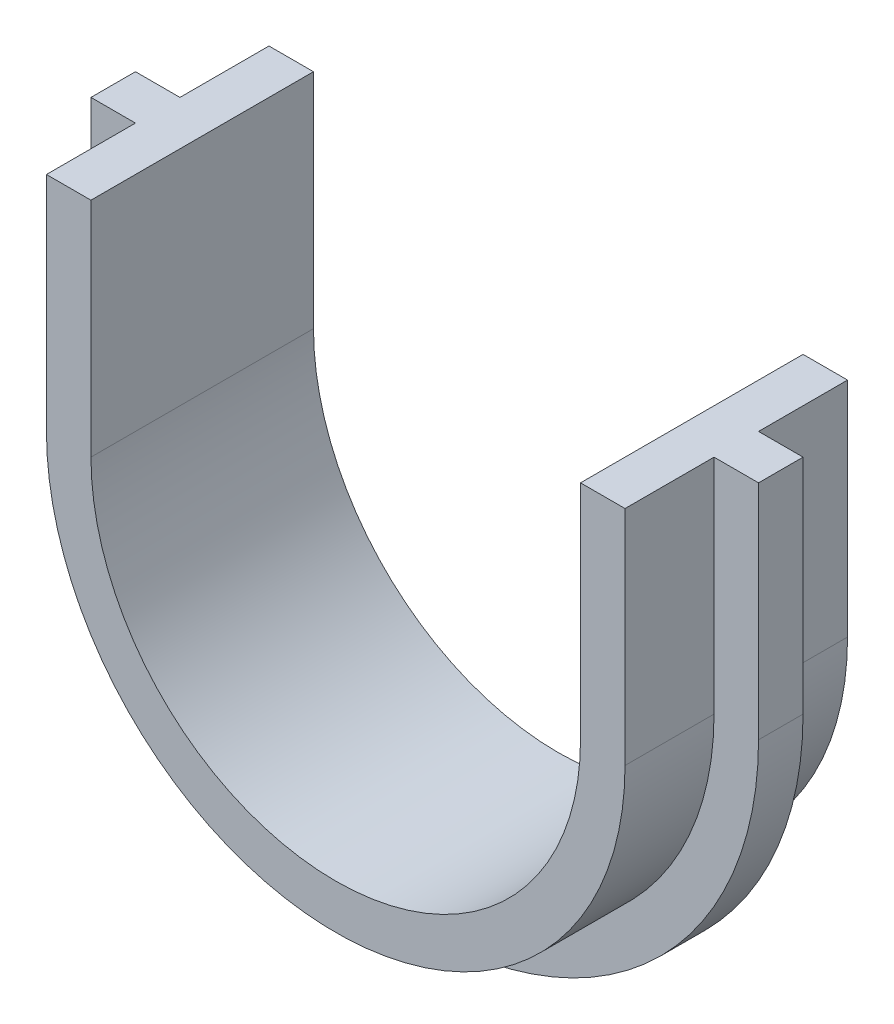
ISO-10303-21;
HEADER;
FILE_DESCRIPTION(('STEP AP214'),'2;1');
FILE_NAME('part.step','',(''),(''),'','','');
FILE_SCHEMA(('AUTOMOTIVE_DESIGN { 1 0 10303 214 1 1 1 1 }'));
ENDSEC;
DATA;
#1=APPLICATION_CONTEXT('core data for automotive mechanical design processes');
#2=APPLICATION_PROTOCOL_DEFINITION('international standard','automotive_design',2000,#1);
#3=PRODUCT_CONTEXT('',#1,'mechanical');
#4=PRODUCT('Part','Part','',(#3));
#5=PRODUCT_RELATED_PRODUCT_CATEGORY('part','',(#4));
#6=PRODUCT_DEFINITION_FORMATION('','',#4);
#7=PRODUCT_DEFINITION_CONTEXT('part definition',#1,'design');
#8=PRODUCT_DEFINITION('design','',#6,#7);
#9=PRODUCT_DEFINITION_SHAPE('','',#8);
#10=(LENGTH_UNIT() NAMED_UNIT(*) SI_UNIT(.MILLI.,.METRE.));
#11=(NAMED_UNIT(*) PLANE_ANGLE_UNIT() SI_UNIT($,.RADIAN.));
#12=(NAMED_UNIT(*) SI_UNIT($,.STERADIAN.) SOLID_ANGLE_UNIT());
#13=UNCERTAINTY_MEASURE_WITH_UNIT(LENGTH_MEASURE(1.E-05),#10,'distance_accuracy_value','');
#14=(GEOMETRIC_REPRESENTATION_CONTEXT(3) GLOBAL_UNCERTAINTY_ASSIGNED_CONTEXT((#13)) GLOBAL_UNIT_ASSIGNED_CONTEXT((#10,
#11,#12)) REPRESENTATION_CONTEXT('',''));
#15=CARTESIAN_POINT('',(0.,0.,0.));
#16=DIRECTION('',(0.,0.,1.));
#17=DIRECTION('',(1.,0.,0.));
#18=AXIS2_PLACEMENT_3D('',#15,#16,#17);
#19=CARTESIAN_POINT('',(0.,23.5,0.));
#20=DIRECTION('',(0.,0.,1.));
#21=DIRECTION('',(1.,0.,0.));
#22=AXIS2_PLACEMENT_3D('',#19,#20,#21);
#23=PLANE('',#22);
#24=CARTESIAN_POINT('',(0.,25.,0.));
#25=DIRECTION('',(0.,0.,1.));
#26=DIRECTION('',(-1.,0.,0.));
#27=AXIS2_PLACEMENT_3D('',#24,#25,#26);
#28=CIRCLE('',#27,13.);
#29=CARTESIAN_POINT('',(-13.,25.,0.));
#30=VERTEX_POINT('',#29);
#31=CARTESIAN_POINT('',(13.,25.,0.));
#32=VERTEX_POINT('',#31);
#33=EDGE_CURVE('E244',#30,#32,#28,.T.);
#34=ORIENTED_EDGE('',*,*,#33,.F.);
#35=DIRECTION('',(0.,1.,0.));
#36=VECTOR('',#35,1.);
#37=CARTESIAN_POINT('',(-13.,25.,0.));
#38=LINE('',#37,#36);
#39=CARTESIAN_POINT('',(-13.,35.,0.));
#40=VERTEX_POINT('',#39);
#41=EDGE_CURVE('E325',#30,#40,#38,.T.);
#42=ORIENTED_EDGE('',*,*,#41,.T.);
#43=DIRECTION('',(1.,0.,0.));
#44=VECTOR('',#43,1.);
#45=CARTESIAN_POINT('',(-13.,35.,0.));
#46=LINE('',#45,#44);
#47=CARTESIAN_POINT('',(-11.0000001639128,35.,0.));
#48=VERTEX_POINT('',#47);
#49=EDGE_CURVE('E326',#40,#48,#46,.T.);
#50=ORIENTED_EDGE('',*,*,#49,.T.);
#51=DIRECTION('',(0.,-1.,0.));
#52=VECTOR('',#51,1.);
#53=CARTESIAN_POINT('',(-11.0000001639128,35.,0.));
#54=LINE('',#53,#52);
#55=CARTESIAN_POINT('',(-11.0000001639128,25.000000372529,0.));
#56=VERTEX_POINT('',#55);
#57=EDGE_CURVE('E186',#48,#56,#54,.T.);
#58=ORIENTED_EDGE('',*,*,#57,.T.);
#59=CARTESIAN_POINT('',(0.,25.,0.));
#60=DIRECTION('',(0.,0.,1.));
#61=DIRECTION('',(-1.,3.3866274935916E-08,0.));
#62=AXIS2_PLACEMENT_3D('',#59,#60,#61);
#63=CIRCLE('',#62,11.0000001639128);
#64=CARTESIAN_POINT('',(11.0000001639128,25.0000003786137,0.));
#65=VERTEX_POINT('',#64);
#66=EDGE_CURVE('E171',#56,#65,#63,.T.);
#67=ORIENTED_EDGE('',*,*,#66,.T.);
#68=DIRECTION('',(0.,-1.,0.));
#69=VECTOR('',#68,1.);
#70=CARTESIAN_POINT('',(11.0000001639128,35.,0.));
#71=LINE('',#70,#69);
#72=CARTESIAN_POINT('',(11.0000001639128,35.,0.));
#73=VERTEX_POINT('',#72);
#74=EDGE_CURVE('E200',#73,#65,#71,.T.);
#75=ORIENTED_EDGE('',*,*,#74,.F.);
#76=DIRECTION('',(-1.,0.,0.));
#77=VECTOR('',#76,1.);
#78=CARTESIAN_POINT('',(13.,35.,0.));
#79=LINE('',#78,#77);
#80=CARTESIAN_POINT('',(13.,35.,0.));
#81=VERTEX_POINT('',#80);
#82=EDGE_CURVE('E206',#81,#73,#79,.T.);
#83=ORIENTED_EDGE('',*,*,#82,.F.);
#84=DIRECTION('',(0.,-1.,0.));
#85=VECTOR('',#84,1.);
#86=CARTESIAN_POINT('',(13.,35.,0.));
#87=LINE('',#86,#85);
#88=EDGE_CURVE('E299',#81,#32,#87,.T.);
#89=ORIENTED_EDGE('',*,*,#88,.T.);
#90=EDGE_LOOP('',(#34,#42,#50,#58,#67,#75,#83,#89));
#91=FACE_BOUND('',#90,.T.);
#92=ADVANCED_FACE('F16',(#91),#23,.F.);
#93=CARTESIAN_POINT('',(0.,23.5,10.));
#94=DIRECTION('',(0.,0.,1.));
#95=DIRECTION('',(1.,0.,0.));
#96=AXIS2_PLACEMENT_3D('',#93,#94,#95);
#97=PLANE('',#96);
#98=CARTESIAN_POINT('',(0.,25.,10.));
#99=DIRECTION('',(0.,0.,1.));
#100=DIRECTION('',(-1.,0.,0.));
#101=AXIS2_PLACEMENT_3D('',#98,#99,#100);
#102=CIRCLE('',#101,13.);
#103=CARTESIAN_POINT('',(-13.,25.,10.));
#104=VERTEX_POINT('',#103);
#105=CARTESIAN_POINT('',(13.,25.,10.));
#106=VERTEX_POINT('',#105);
#107=EDGE_CURVE('E10',#104,#106,#102,.T.);
#108=ORIENTED_EDGE('',*,*,#107,.T.);
#109=DIRECTION('',(0.,1.,0.));
#110=VECTOR('',#109,1.);
#111=CARTESIAN_POINT('',(13.,35.,10.));
#112=LINE('',#111,#110);
#113=CARTESIAN_POINT('',(13.,35.,10.));
#114=VERTEX_POINT('',#113);
#115=EDGE_CURVE('E42',#106,#114,#112,.T.);
#116=ORIENTED_EDGE('',*,*,#115,.T.);
#117=DIRECTION('',(-1.,0.,0.));
#118=VECTOR('',#117,1.);
#119=CARTESIAN_POINT('',(13.,35.,10.));
#120=LINE('',#119,#118);
#121=CARTESIAN_POINT('',(11.0000001639128,35.,10.));
#122=VERTEX_POINT('',#121);
#123=EDGE_CURVE('E207',#114,#122,#120,.T.);
#124=ORIENTED_EDGE('',*,*,#123,.T.);
#125=DIRECTION('',(0.,-1.,0.));
#126=VECTOR('',#125,1.);
#127=CARTESIAN_POINT('',(11.0000001639128,35.,10.));
#128=LINE('',#127,#126);
#129=CARTESIAN_POINT('',(11.0000001639128,25.0000003786137,10.));
#130=VERTEX_POINT('',#129);
#131=EDGE_CURVE('E164',#122,#130,#128,.T.);
#132=ORIENTED_EDGE('',*,*,#131,.T.);
#133=CARTESIAN_POINT('',(0.,25.,10.));
#134=DIRECTION('',(0.,0.,-1.));
#135=DIRECTION('',(-1.,3.3866274935916E-08,0.));
#136=AXIS2_PLACEMENT_3D('',#133,#134,#135);
#137=CIRCLE('',#136,11.0000001639128);
#138=CARTESIAN_POINT('',(-11.0000001639128,25.000000372529,10.));
#139=VERTEX_POINT('',#138);
#140=EDGE_CURVE('E158',#130,#139,#137,.T.);
#141=ORIENTED_EDGE('',*,*,#140,.T.);
#142=DIRECTION('',(0.,1.,0.));
#143=VECTOR('',#142,1.);
#144=CARTESIAN_POINT('',(-11.0000001639128,35.,10.));
#145=LINE('',#144,#143);
#146=CARTESIAN_POINT('',(-11.0000001639128,35.,10.));
#147=VERTEX_POINT('',#146);
#148=EDGE_CURVE('E165',#139,#147,#145,.T.);
#149=ORIENTED_EDGE('',*,*,#148,.T.);
#150=DIRECTION('',(-1.,0.,0.));
#151=VECTOR('',#150,1.);
#152=CARTESIAN_POINT('',(-13.,35.,10.));
#153=LINE('',#152,#151);
#154=CARTESIAN_POINT('',(-13.,35.,10.));
#155=VERTEX_POINT('',#154);
#156=EDGE_CURVE('E329',#147,#155,#153,.T.);
#157=ORIENTED_EDGE('',*,*,#156,.T.);
#158=DIRECTION('',(0.,-1.,0.));
#159=VECTOR('',#158,1.);
#160=CARTESIAN_POINT('',(-13.,25.,10.));
#161=LINE('',#160,#159);
#162=EDGE_CURVE('E315',#155,#104,#161,.T.);
#163=ORIENTED_EDGE('',*,*,#162,.T.);
#164=EDGE_LOOP('',(#108,#116,#124,#132,#141,#149,#157,#163));
#165=FACE_BOUND('',#164,.T.);
#166=ADVANCED_FACE('F159',(#165),#97,.T.);
#167=CARTESIAN_POINT('',(0.,25.,0.));
#168=DIRECTION('',(0.,0.,1.));
#169=DIRECTION('',(-1.,0.,0.));
#170=AXIS2_PLACEMENT_3D('',#167,#168,#169);
#171=CYLINDRICAL_SURFACE('',#170,13.);
#172=CARTESIAN_POINT('',(0.,25.,6.00000008940697));
#173=DIRECTION('',(0.,0.,1.));
#174=DIRECTION('',(-1.,0.,0.));
#175=AXIS2_PLACEMENT_3D('',#172,#173,#174);
#176=CIRCLE('',#175,13.);
#177=CARTESIAN_POINT('',(-13.0000001937151,25.,6.00000008940697));
#178=VERTEX_POINT('',#177);
#179=CARTESIAN_POINT('',(13.0000001937151,25.,6.00000008940697));
#180=VERTEX_POINT('',#179);
#181=EDGE_CURVE('E269',#178,#180,#176,.T.);
#182=ORIENTED_EDGE('',*,*,#181,.T.);
#183=DIRECTION('',(0.,0.,1.));
#184=VECTOR('',#183,1.);
#185=CARTESIAN_POINT('',(13.,25.,0.));
#186=LINE('',#185,#184);
#187=EDGE_CURVE('E24',#180,#106,#186,.T.);
#188=ORIENTED_EDGE('',*,*,#187,.T.);
#189=ORIENTED_EDGE('',*,*,#107,.F.);
#190=DIRECTION('',(0.,0.,1.));
#191=VECTOR('',#190,1.);
#192=CARTESIAN_POINT('',(-13.,25.,0.));
#193=LINE('',#192,#191);
#194=EDGE_CURVE('E249',#178,#104,#193,.T.);
#195=ORIENTED_EDGE('',*,*,#194,.F.);
#196=EDGE_LOOP('',(#182,#188,#189,#195));
#197=FACE_BOUND('',#196,.T.);
#198=ADVANCED_FACE('F486',(#197),#171,.T.);
#199=CARTESIAN_POINT('',(13.,25.,0.));
#200=DIRECTION('',(1.,0.,0.));
#201=DIRECTION('',(0.,1.,0.));
#202=AXIS2_PLACEMENT_3D('',#199,#200,#201);
#203=PLANE('',#202);
#204=DIRECTION('',(0.,1.,0.));
#205=VECTOR('',#204,1.);
#206=CARTESIAN_POINT('',(13.,30.,6.00000008940697));
#207=LINE('',#206,#205);
#208=CARTESIAN_POINT('',(13.0000001937151,35.,6.00000008940697));
#209=VERTEX_POINT('',#208);
#210=EDGE_CURVE('E242',#180,#209,#207,.T.);
#211=ORIENTED_EDGE('',*,*,#210,.T.);
#212=DIRECTION('',(0.,0.,1.));
#213=VECTOR('',#212,1.);
#214=CARTESIAN_POINT('',(13.,35.,0.));
#215=LINE('',#214,#213);
#216=EDGE_CURVE('E215',#209,#114,#215,.T.);
#217=ORIENTED_EDGE('',*,*,#216,.T.);
#218=ORIENTED_EDGE('',*,*,#115,.F.);
#219=ORIENTED_EDGE('',*,*,#187,.F.);
#220=EDGE_LOOP('',(#211,#217,#218,#219));
#221=FACE_BOUND('',#220,.T.);
#222=ADVANCED_FACE('F482',(#221),#203,.T.);
#223=CARTESIAN_POINT('',(13.,35.,0.));
#224=DIRECTION('',(0.,1.,0.));
#225=DIRECTION('',(1.,0.,0.));
#226=AXIS2_PLACEMENT_3D('',#223,#224,#225);
#227=PLANE('',#226);
#228=ORIENTED_EDGE('',*,*,#82,.T.);
#229=DIRECTION('',(0.,0.,1.));
#230=VECTOR('',#229,1.);
#231=CARTESIAN_POINT('',(11.0000001639128,35.,0.));
#232=LINE('',#231,#230);
#233=EDGE_CURVE('E205',#73,#122,#232,.T.);
#234=ORIENTED_EDGE('',*,*,#233,.T.);
#235=ORIENTED_EDGE('',*,*,#123,.F.);
#236=ORIENTED_EDGE('',*,*,#216,.F.);
#237=DIRECTION('',(1.,0.,0.));
#238=VECTOR('',#237,1.);
#239=CARTESIAN_POINT('',(13.0000001937151,35.,6.00000008940697));
#240=LINE('',#239,#238);
#241=CARTESIAN_POINT('',(15.0000002235174,35.,6.00000008940697));
#242=VERTEX_POINT('',#241);
#243=EDGE_CURVE('E239',#209,#242,#240,.T.);
#244=ORIENTED_EDGE('',*,*,#243,.T.);
#245=DIRECTION('',(0.,0.,-1.));
#246=VECTOR('',#245,1.);
#247=CARTESIAN_POINT('',(15.0000002235174,35.,6.00000008940697));
#248=LINE('',#247,#246);
#249=CARTESIAN_POINT('',(15.0000002235174,35.,4.00000005960464));
#250=VERTEX_POINT('',#249);
#251=EDGE_CURVE('E235',#242,#250,#248,.T.);
#252=ORIENTED_EDGE('',*,*,#251,.T.);
#253=DIRECTION('',(-1.,0.,0.));
#254=VECTOR('',#253,1.);
#255=CARTESIAN_POINT('',(15.0000002235174,35.,4.00000005960464));
#256=LINE('',#255,#254);
#257=CARTESIAN_POINT('',(13.0000001937151,35.,4.00000005960464));
#258=VERTEX_POINT('',#257);
#259=EDGE_CURVE('E293',#250,#258,#256,.T.);
#260=ORIENTED_EDGE('',*,*,#259,.T.);
#261=DIRECTION('',(0.,0.,1.));
#262=VECTOR('',#261,1.);
#263=CARTESIAN_POINT('',(13.,35.,0.));
#264=LINE('',#263,#262);
#265=EDGE_CURVE('E301',#81,#258,#264,.T.);
#266=ORIENTED_EDGE('',*,*,#265,.F.);
#267=EDGE_LOOP('',(#228,#234,#235,#236,#244,#252,#260,#266));
#268=FACE_BOUND('',#267,.T.);
#269=ADVANCED_FACE('F479',(#268),#227,.T.);
#270=CARTESIAN_POINT('',(11.0000001639128,35.,0.));
#271=DIRECTION('',(-1.,0.,0.));
#272=DIRECTION('',(0.,0.,1.));
#273=AXIS2_PLACEMENT_3D('',#270,#271,#272);
#274=PLANE('',#273);
#275=ORIENTED_EDGE('',*,*,#74,.T.);
#276=DIRECTION('',(0.,0.,1.));
#277=VECTOR('',#276,1.);
#278=CARTESIAN_POINT('',(11.0000001639128,25.0000003786137,0.));
#279=LINE('',#278,#277);
#280=EDGE_CURVE('E168',#65,#130,#279,.T.);
#281=ORIENTED_EDGE('',*,*,#280,.T.);
#282=ORIENTED_EDGE('',*,*,#131,.F.);
#283=ORIENTED_EDGE('',*,*,#233,.F.);
#284=EDGE_LOOP('',(#275,#281,#282,#283));
#285=FACE_BOUND('',#284,.T.);
#286=ADVANCED_FACE('F503',(#285),#274,.T.);
#287=CARTESIAN_POINT('',(0.,25.,0.));
#288=DIRECTION('',(0.,0.,1.));
#289=DIRECTION('',(2.76574439443042E-10,-1.,0.));
#290=AXIS2_PLACEMENT_3D('',#287,#288,#289);
#291=CYLINDRICAL_SURFACE('',#290,11.0000001639128);
#292=ORIENTED_EDGE('',*,*,#66,.F.);
#293=DIRECTION('',(0.,0.,1.));
#294=VECTOR('',#293,1.);
#295=CARTESIAN_POINT('',(-11.0000001639128,25.000000372529,0.));
#296=LINE('',#295,#294);
#297=EDGE_CURVE('E173',#56,#139,#296,.T.);
#298=ORIENTED_EDGE('',*,*,#297,.T.);
#299=ORIENTED_EDGE('',*,*,#140,.F.);
#300=ORIENTED_EDGE('',*,*,#280,.F.);
#301=EDGE_LOOP('',(#292,#298,#299,#300));
#302=FACE_BOUND('',#301,.T.);
#303=ADVANCED_FACE('F175',(#302),#291,.F.);
#304=CARTESIAN_POINT('',(-11.0000001639128,25.000000372529,0.));
#305=DIRECTION('',(1.,0.,0.));
#306=DIRECTION('',(0.,1.,0.));
#307=AXIS2_PLACEMENT_3D('',#304,#305,#306);
#308=PLANE('',#307);
#309=ORIENTED_EDGE('',*,*,#57,.F.);
#310=DIRECTION('',(0.,0.,1.));
#311=VECTOR('',#310,1.);
#312=CARTESIAN_POINT('',(-11.0000001639128,35.,0.));
#313=LINE('',#312,#311);
#314=EDGE_CURVE('E183',#48,#147,#313,.T.);
#315=ORIENTED_EDGE('',*,*,#314,.T.);
#316=ORIENTED_EDGE('',*,*,#148,.F.);
#317=ORIENTED_EDGE('',*,*,#297,.F.);
#318=EDGE_LOOP('',(#309,#315,#316,#317));
#319=FACE_BOUND('',#318,.T.);
#320=ADVANCED_FACE('F185',(#319),#308,.T.);
#321=CARTESIAN_POINT('',(-11.0000001639128,35.,0.));
#322=DIRECTION('',(0.,1.,0.));
#323=DIRECTION('',(1.,0.,0.));
#324=AXIS2_PLACEMENT_3D('',#321,#322,#323);
#325=PLANE('',#324);
#326=ORIENTED_EDGE('',*,*,#49,.F.);
#327=DIRECTION('',(0.,0.,1.));
#328=VECTOR('',#327,1.);
#329=CARTESIAN_POINT('',(-13.,35.,0.));
#330=LINE('',#329,#328);
#331=CARTESIAN_POINT('',(-13.0000001937151,35.,4.00000005960464));
#332=VERTEX_POINT('',#331);
#333=EDGE_CURVE('E317',#40,#332,#330,.T.);
#334=ORIENTED_EDGE('',*,*,#333,.T.);
#335=DIRECTION('',(1.,0.,0.));
#336=VECTOR('',#335,1.);
#337=CARTESIAN_POINT('',(-15.0000002235174,35.,4.00000005960464));
#338=LINE('',#337,#336);
#339=CARTESIAN_POINT('',(-15.0000002235174,35.,4.00000005960464));
#340=VERTEX_POINT('',#339);
#341=EDGE_CURVE('E280',#340,#332,#338,.T.);
#342=ORIENTED_EDGE('',*,*,#341,.F.);
#343=DIRECTION('',(0.,0.,-1.));
#344=VECTOR('',#343,1.);
#345=CARTESIAN_POINT('',(-15.0000002235174,35.,6.00000008940697));
#346=LINE('',#345,#344);
#347=CARTESIAN_POINT('',(-15.0000002235174,35.,6.00000008940697));
#348=VERTEX_POINT('',#347);
#349=EDGE_CURVE('E251',#348,#340,#346,.T.);
#350=ORIENTED_EDGE('',*,*,#349,.F.);
#351=DIRECTION('',(-1.,0.,0.));
#352=VECTOR('',#351,1.);
#353=CARTESIAN_POINT('',(-13.0000001937151,35.,6.00000008940697));
#354=LINE('',#353,#352);
#355=CARTESIAN_POINT('',(-13.0000001937151,35.,6.00000008940697));
#356=VERTEX_POINT('',#355);
#357=EDGE_CURVE('E243',#356,#348,#354,.T.);
#358=ORIENTED_EDGE('',*,*,#357,.F.);
#359=DIRECTION('',(0.,0.,1.));
#360=VECTOR('',#359,1.);
#361=CARTESIAN_POINT('',(-13.,35.,0.));
#362=LINE('',#361,#360);
#363=EDGE_CURVE('E312',#356,#155,#362,.T.);
#364=ORIENTED_EDGE('',*,*,#363,.T.);
#365=ORIENTED_EDGE('',*,*,#156,.F.);
#366=ORIENTED_EDGE('',*,*,#314,.F.);
#367=EDGE_LOOP('',(#326,#334,#342,#350,#358,#364,#365,#366));
#368=FACE_BOUND('',#367,.T.);
#369=ADVANCED_FACE('F466',(#368),#325,.T.);
#370=CARTESIAN_POINT('',(-13.,35.,0.));
#371=DIRECTION('',(-1.,0.,0.));
#372=DIRECTION('',(0.,0.,1.));
#373=AXIS2_PLACEMENT_3D('',#370,#371,#372);
#374=PLANE('',#373);
#375=DIRECTION('',(0.,1.,0.));
#376=VECTOR('',#375,1.);
#377=CARTESIAN_POINT('',(-13.,35.,4.00000005960464));
#378=LINE('',#377,#376);
#379=CARTESIAN_POINT('',(-13.0000001937151,25.,4.00000005960464));
#380=VERTEX_POINT('',#379);
#381=EDGE_CURVE('E281',#380,#332,#378,.T.);
#382=ORIENTED_EDGE('',*,*,#381,.T.);
#383=ORIENTED_EDGE('',*,*,#333,.F.);
#384=ORIENTED_EDGE('',*,*,#41,.F.);
#385=DIRECTION('',(0.,0.,1.));
#386=VECTOR('',#385,1.);
#387=CARTESIAN_POINT('',(-13.,25.,0.));
#388=LINE('',#387,#386);
#389=EDGE_CURVE('E246',#30,#380,#388,.T.);
#390=ORIENTED_EDGE('',*,*,#389,.T.);
#391=EDGE_LOOP('',(#382,#383,#384,#390));
#392=FACE_BOUND('',#391,.T.);
#393=ADVANCED_FACE('F493',(#392),#374,.T.);
#394=CARTESIAN_POINT('',(-13.,35.,0.));
#395=DIRECTION('',(-1.,0.,0.));
#396=DIRECTION('',(0.,0.,1.));
#397=AXIS2_PLACEMENT_3D('',#394,#395,#396);
#398=PLANE('',#397);
#399=DIRECTION('',(0.,-1.,0.));
#400=VECTOR('',#399,1.);
#401=CARTESIAN_POINT('',(-13.,35.,6.00000008940697));
#402=LINE('',#401,#400);
#403=EDGE_CURVE('E272',#356,#178,#402,.T.);
#404=ORIENTED_EDGE('',*,*,#403,.T.);
#405=ORIENTED_EDGE('',*,*,#194,.T.);
#406=ORIENTED_EDGE('',*,*,#162,.F.);
#407=ORIENTED_EDGE('',*,*,#363,.F.);
#408=EDGE_LOOP('',(#404,#405,#406,#407));
#409=FACE_BOUND('',#408,.T.);
#410=ADVANCED_FACE('F487',(#409),#398,.T.);
#411=CARTESIAN_POINT('',(0.,25.,0.));
#412=DIRECTION('',(0.,0.,1.));
#413=DIRECTION('',(-1.,0.,0.));
#414=AXIS2_PLACEMENT_3D('',#411,#412,#413);
#415=CYLINDRICAL_SURFACE('',#414,13.);
#416=CARTESIAN_POINT('',(0.,25.,4.00000005960464));
#417=DIRECTION('',(0.,0.,-1.));
#418=DIRECTION('',(-1.,0.,0.));
#419=AXIS2_PLACEMENT_3D('',#416,#417,#418);
#420=CIRCLE('',#419,13.);
#421=CARTESIAN_POINT('',(13.0000001937151,25.,4.00000005960464));
#422=VERTEX_POINT('',#421);
#423=EDGE_CURVE('E285',#422,#380,#420,.T.);
#424=ORIENTED_EDGE('',*,*,#423,.T.);
#425=ORIENTED_EDGE('',*,*,#389,.F.);
#426=ORIENTED_EDGE('',*,*,#33,.T.);
#427=DIRECTION('',(0.,0.,1.));
#428=VECTOR('',#427,1.);
#429=CARTESIAN_POINT('',(13.,25.,0.));
#430=LINE('',#429,#428);
#431=EDGE_CURVE('E300',#32,#422,#430,.T.);
#432=ORIENTED_EDGE('',*,*,#431,.T.);
#433=EDGE_LOOP('',(#424,#425,#426,#432));
#434=FACE_BOUND('',#433,.T.);
#435=ADVANCED_FACE('F497',(#434),#415,.T.);
#436=CARTESIAN_POINT('',(13.,25.,0.));
#437=DIRECTION('',(1.,0.,0.));
#438=DIRECTION('',(0.,1.,0.));
#439=AXIS2_PLACEMENT_3D('',#436,#437,#438);
#440=PLANE('',#439);
#441=DIRECTION('',(0.,-1.,0.));
#442=VECTOR('',#441,1.);
#443=CARTESIAN_POINT('',(13.,30.,4.00000005960464));
#444=LINE('',#443,#442);
#445=EDGE_CURVE('E287',#258,#422,#444,.T.);
#446=ORIENTED_EDGE('',*,*,#445,.T.);
#447=ORIENTED_EDGE('',*,*,#431,.F.);
#448=ORIENTED_EDGE('',*,*,#88,.F.);
#449=ORIENTED_EDGE('',*,*,#265,.T.);
#450=EDGE_LOOP('',(#446,#447,#448,#449));
#451=FACE_BOUND('',#450,.T.);
#452=ADVANCED_FACE('F498',(#451),#440,.T.);
#453=CARTESIAN_POINT('',(-15.0000002235174,35.,4.00000005960464));
#454=DIRECTION('',(0.,0.,-1.));
#455=DIRECTION('',(0.,-1.,0.));
#456=AXIS2_PLACEMENT_3D('',#453,#454,#455);
#457=PLANE('',#456);
#458=ORIENTED_EDGE('',*,*,#341,.T.);
#459=ORIENTED_EDGE('',*,*,#381,.F.);
#460=ORIENTED_EDGE('',*,*,#423,.F.);
#461=ORIENTED_EDGE('',*,*,#445,.F.);
#462=ORIENTED_EDGE('',*,*,#259,.F.);
#463=DIRECTION('',(0.,1.,0.));
#464=VECTOR('',#463,1.);
#465=CARTESIAN_POINT('',(15.0000002235174,25.,4.00000005960464));
#466=LINE('',#465,#464);
#467=CARTESIAN_POINT('',(15.0000002235174,25.,4.00000005960464));
#468=VERTEX_POINT('',#467);
#469=EDGE_CURVE('E223',#468,#250,#466,.T.);
#470=ORIENTED_EDGE('',*,*,#469,.F.);
#471=CARTESIAN_POINT('',(0.,25.,4.00000005960464));
#472=DIRECTION('',(0.,0.,1.));
#473=DIRECTION('',(-1.,0.,0.));
#474=AXIS2_PLACEMENT_3D('',#471,#472,#473);
#475=CIRCLE('',#474,15.0000002235174);
#476=CARTESIAN_POINT('',(-15.0000002235174,25.,4.00000005960464));
#477=VERTEX_POINT('',#476);
#478=EDGE_CURVE('E240',#477,#468,#475,.T.);
#479=ORIENTED_EDGE('',*,*,#478,.F.);
#480=DIRECTION('',(0.,-1.,0.));
#481=VECTOR('',#480,1.);
#482=CARTESIAN_POINT('',(-15.0000002235174,35.,4.00000005960464));
#483=LINE('',#482,#481);
#484=EDGE_CURVE('E260',#340,#477,#483,.T.);
#485=ORIENTED_EDGE('',*,*,#484,.F.);
#486=EDGE_LOOP('',(#458,#459,#460,#461,#462,#470,#479,#485));
#487=FACE_BOUND('',#486,.T.);
#488=ADVANCED_FACE('F475',(#487),#457,.T.);
#489=CARTESIAN_POINT('',(-13.0000001937151,35.,6.00000008940697));
#490=DIRECTION('',(0.,0.,1.));
#491=DIRECTION('',(1.,0.,0.));
#492=AXIS2_PLACEMENT_3D('',#489,#490,#491);
#493=PLANE('',#492);
#494=ORIENTED_EDGE('',*,*,#357,.T.);
#495=DIRECTION('',(0.,-1.,0.));
#496=VECTOR('',#495,1.);
#497=CARTESIAN_POINT('',(-15.0000002235174,35.,6.00000008940697));
#498=LINE('',#497,#496);
#499=CARTESIAN_POINT('',(-15.0000002235174,25.,6.00000008940697));
#500=VERTEX_POINT('',#499);
#501=EDGE_CURVE('E257',#348,#500,#498,.T.);
#502=ORIENTED_EDGE('',*,*,#501,.T.);
#503=CARTESIAN_POINT('',(0.,25.,6.00000008940697));
#504=DIRECTION('',(0.,0.,1.));
#505=DIRECTION('',(-1.,0.,0.));
#506=AXIS2_PLACEMENT_3D('',#503,#504,#505);
#507=CIRCLE('',#506,15.0000002235174);
#508=CARTESIAN_POINT('',(15.0000002235174,25.,6.00000008940697));
#509=VERTEX_POINT('',#508);
#510=EDGE_CURVE('E237',#500,#509,#507,.T.);
#511=ORIENTED_EDGE('',*,*,#510,.T.);
#512=DIRECTION('',(0.,1.,0.));
#513=VECTOR('',#512,1.);
#514=CARTESIAN_POINT('',(15.0000002235174,25.,6.00000008940697));
#515=LINE('',#514,#513);
#516=EDGE_CURVE('E227',#509,#242,#515,.T.);
#517=ORIENTED_EDGE('',*,*,#516,.T.);
#518=ORIENTED_EDGE('',*,*,#243,.F.);
#519=ORIENTED_EDGE('',*,*,#210,.F.);
#520=ORIENTED_EDGE('',*,*,#181,.F.);
#521=ORIENTED_EDGE('',*,*,#403,.F.);
#522=EDGE_LOOP('',(#494,#502,#511,#517,#518,#519,#520,#521));
#523=FACE_BOUND('',#522,.T.);
#524=ADVANCED_FACE('F459',(#523),#493,.T.);
#525=CARTESIAN_POINT('',(-15.0000002235174,35.,6.00000008940697));
#526=DIRECTION('',(-1.,0.,0.));
#527=DIRECTION('',(0.,0.,1.));
#528=AXIS2_PLACEMENT_3D('',#525,#526,#527);
#529=PLANE('',#528);
#530=ORIENTED_EDGE('',*,*,#349,.T.);
#531=ORIENTED_EDGE('',*,*,#484,.T.);
#532=DIRECTION('',(0.,0.,-1.));
#533=VECTOR('',#532,1.);
#534=CARTESIAN_POINT('',(-15.0000002235174,25.,6.00000008940697));
#535=LINE('',#534,#533);
#536=EDGE_CURVE('E231',#500,#477,#535,.T.);
#537=ORIENTED_EDGE('',*,*,#536,.F.);
#538=ORIENTED_EDGE('',*,*,#501,.F.);
#539=EDGE_LOOP('',(#530,#531,#537,#538));
#540=FACE_BOUND('',#539,.T.);
#541=ADVANCED_FACE('F470',(#540),#529,.T.);
#542=CARTESIAN_POINT('',(0.,25.,5.00000007450581));
#543=DIRECTION('',(0.,0.,1.));
#544=DIRECTION('',(-1.,0.,0.));
#545=AXIS2_PLACEMENT_3D('',#542,#543,#544);
#546=CYLINDRICAL_SURFACE('',#545,15.0000002235174);
#547=ORIENTED_EDGE('',*,*,#536,.T.);
#548=ORIENTED_EDGE('',*,*,#478,.T.);
#549=DIRECTION('',(0.,0.,-1.));
#550=VECTOR('',#549,1.);
#551=CARTESIAN_POINT('',(15.0000002235174,25.,6.00000008940697));
#552=LINE('',#551,#550);
#553=EDGE_CURVE('E437',#509,#468,#552,.T.);
#554=ORIENTED_EDGE('',*,*,#553,.F.);
#555=ORIENTED_EDGE('',*,*,#510,.F.);
#556=EDGE_LOOP('',(#547,#548,#554,#555));
#557=FACE_BOUND('',#556,.T.);
#558=ADVANCED_FACE('F452',(#557),#546,.T.);
#559=CARTESIAN_POINT('',(15.0000002235174,25.,6.00000008940697));
#560=DIRECTION('',(1.,0.,0.));
#561=DIRECTION('',(0.,1.,0.));
#562=AXIS2_PLACEMENT_3D('',#559,#560,#561);
#563=PLANE('',#562);
#564=ORIENTED_EDGE('',*,*,#553,.T.);
#565=ORIENTED_EDGE('',*,*,#469,.T.);
#566=ORIENTED_EDGE('',*,*,#251,.F.);
#567=ORIENTED_EDGE('',*,*,#516,.F.);
#568=EDGE_LOOP('',(#564,#565,#566,#567));
#569=FACE_BOUND('',#568,.T.);
#570=ADVANCED_FACE('F448',(#569),#563,.T.);
#571=CLOSED_SHELL('',(#92,#166,#198,#222,#269,#286,#303,#320,#369,#393,#410,#435,#452,#488,#524,
#541,#558,#570));
#572=MANIFOLD_SOLID_BREP('B1',#571);
#573=ADVANCED_BREP_SHAPE_REPRESENTATION('',(#18,#572),#14);
#574=SHAPE_DEFINITION_REPRESENTATION(#9,#573);
ENDSEC;
END-ISO-10303-21;
